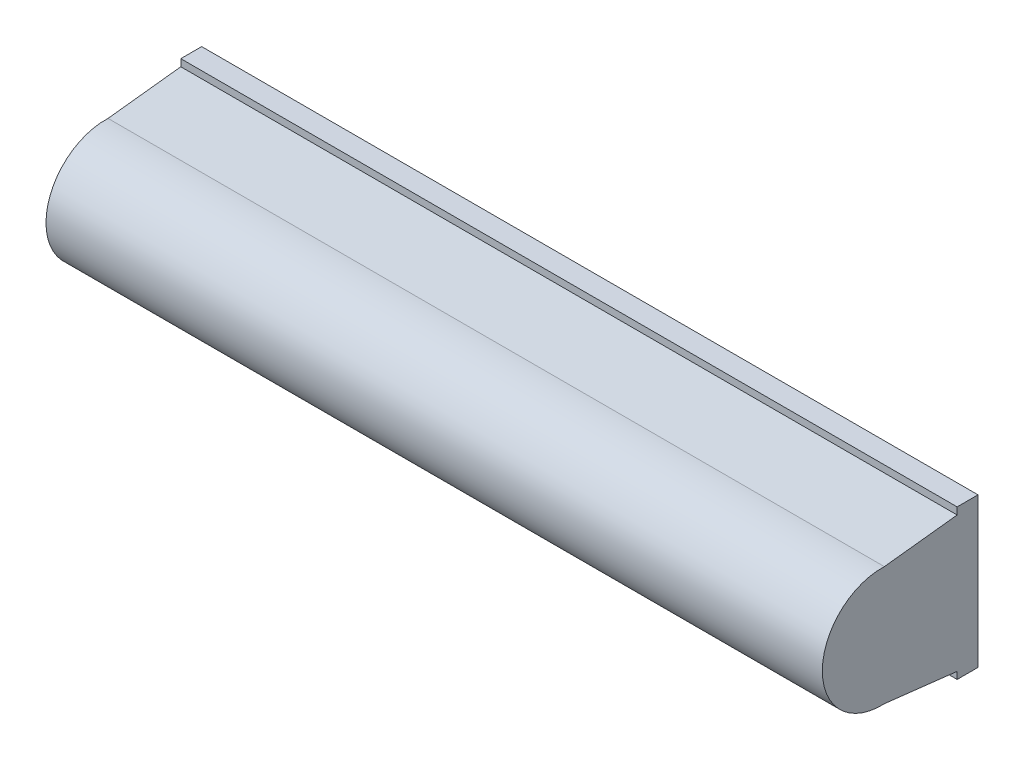
ISO-10303-21;
HEADER;
FILE_DESCRIPTION(('STEP AP214'),'2;1');
FILE_NAME('part.step','',(''),(''),'','','');
FILE_SCHEMA(('AUTOMOTIVE_DESIGN { 1 0 10303 214 1 1 1 1 }'));
ENDSEC;
DATA;
#1=APPLICATION_CONTEXT('core data for automotive mechanical design processes');
#2=APPLICATION_PROTOCOL_DEFINITION('international standard','automotive_design',2000,#1);
#3=PRODUCT_CONTEXT('',#1,'mechanical');
#4=PRODUCT('Part','Part','',(#3));
#5=PRODUCT_RELATED_PRODUCT_CATEGORY('part','',(#4));
#6=PRODUCT_DEFINITION_FORMATION('','',#4);
#7=PRODUCT_DEFINITION_CONTEXT('part definition',#1,'design');
#8=PRODUCT_DEFINITION('design','',#6,#7);
#9=PRODUCT_DEFINITION_SHAPE('','',#8);
#10=(LENGTH_UNIT() NAMED_UNIT(*) SI_UNIT(.MILLI.,.METRE.));
#11=(NAMED_UNIT(*) PLANE_ANGLE_UNIT() SI_UNIT($,.RADIAN.));
#12=(NAMED_UNIT(*) SI_UNIT($,.STERADIAN.) SOLID_ANGLE_UNIT());
#13=UNCERTAINTY_MEASURE_WITH_UNIT(LENGTH_MEASURE(1.E-05),#10,'distance_accuracy_value','');
#14=(GEOMETRIC_REPRESENTATION_CONTEXT(3) GLOBAL_UNCERTAINTY_ASSIGNED_CONTEXT((#13)) GLOBAL_UNIT_ASSIGNED_CONTEXT((#10,
#11,#12)) REPRESENTATION_CONTEXT('',''));
#15=CARTESIAN_POINT('',(0.,0.,0.));
#16=DIRECTION('',(0.,0.,1.));
#17=DIRECTION('',(1.,0.,0.));
#18=AXIS2_PLACEMENT_3D('',#15,#16,#17);
#19=CARTESIAN_POINT('',(80.,-15.405,4.3));
#20=DIRECTION('',(0.,1.,0.));
#21=DIRECTION('',(0.,0.,1.));
#22=AXIS2_PLACEMENT_3D('',#19,#20,#21);
#23=PLANE('',#22);
#24=DIRECTION('',(0.,0.,-1.));
#25=VECTOR('',#24,1.);
#26=CARTESIAN_POINT('',(-80.,-15.405,4.3));
#27=LINE('',#26,#25);
#28=CARTESIAN_POINT('',(-80.,-15.405,4.3));
#29=VERTEX_POINT('',#28);
#30=CARTESIAN_POINT('',(-80.,-15.405,0.));
#31=VERTEX_POINT('',#30);
#32=EDGE_CURVE('E129',#29,#31,#27,.T.);
#33=ORIENTED_EDGE('',*,*,#32,.T.);
#34=DIRECTION('',(-1.,0.,0.));
#35=VECTOR('',#34,1.);
#36=CARTESIAN_POINT('',(80.,-15.405,0.));
#37=LINE('',#36,#35);
#38=CARTESIAN_POINT('',(80.,-15.405,0.));
#39=VERTEX_POINT('',#38);
#40=EDGE_CURVE('E11',#39,#31,#37,.T.);
#41=ORIENTED_EDGE('',*,*,#40,.F.);
#42=DIRECTION('',(0.,0.,-1.));
#43=VECTOR('',#42,1.);
#44=CARTESIAN_POINT('',(80.,-15.405,4.3));
#45=LINE('',#44,#43);
#46=CARTESIAN_POINT('',(80.,-15.405,4.3));
#47=VERTEX_POINT('',#46);
#48=EDGE_CURVE('E143',#47,#39,#45,.T.);
#49=ORIENTED_EDGE('',*,*,#48,.F.);
#50=DIRECTION('',(-1.,0.,0.));
#51=VECTOR('',#50,1.);
#52=CARTESIAN_POINT('',(80.,-15.405,4.3));
#53=LINE('',#52,#51);
#54=EDGE_CURVE('E125',#47,#29,#53,.T.);
#55=ORIENTED_EDGE('',*,*,#54,.T.);
#56=EDGE_LOOP('',(#33,#41,#49,#55));
#57=FACE_BOUND('',#56,.T.);
#58=ADVANCED_FACE('F33',(#57),#23,.F.);
#59=CARTESIAN_POINT('',(80.,-15.405,0.));
#60=DIRECTION('',(0.,0.,1.));
#61=DIRECTION('',(1.,0.,0.));
#62=AXIS2_PLACEMENT_3D('',#59,#60,#61);
#63=PLANE('',#62);
#64=DIRECTION('',(0.,1.,0.));
#65=VECTOR('',#64,1.);
#66=CARTESIAN_POINT('',(-80.,-15.405,0.));
#67=LINE('',#66,#65);
#68=CARTESIAN_POINT('',(-80.,15.405,0.));
#69=VERTEX_POINT('',#68);
#70=EDGE_CURVE('E132',#31,#69,#67,.T.);
#71=ORIENTED_EDGE('',*,*,#70,.T.);
#72=DIRECTION('',(-1.,0.,0.));
#73=VECTOR('',#72,1.);
#74=CARTESIAN_POINT('',(80.,15.405,0.));
#75=LINE('',#74,#73);
#76=CARTESIAN_POINT('',(80.,15.405,0.));
#77=VERTEX_POINT('',#76);
#78=EDGE_CURVE('E41',#77,#69,#75,.T.);
#79=ORIENTED_EDGE('',*,*,#78,.F.);
#80=DIRECTION('',(0.,1.,0.));
#81=VECTOR('',#80,1.);
#82=CARTESIAN_POINT('',(80.,-15.405,0.));
#83=LINE('',#82,#81);
#84=EDGE_CURVE('E92',#39,#77,#83,.T.);
#85=ORIENTED_EDGE('',*,*,#84,.F.);
#86=ORIENTED_EDGE('',*,*,#40,.T.);
#87=EDGE_LOOP('',(#71,#79,#85,#86));
#88=FACE_BOUND('',#87,.T.);
#89=ADVANCED_FACE('F178',(#88),#63,.F.);
#90=CARTESIAN_POINT('',(80.,15.405,0.));
#91=DIRECTION('',(0.,-1.,0.));
#92=DIRECTION('',(0.,0.,-1.));
#93=AXIS2_PLACEMENT_3D('',#90,#91,#92);
#94=PLANE('',#93);
#95=DIRECTION('',(0.,0.,1.));
#96=VECTOR('',#95,1.);
#97=CARTESIAN_POINT('',(-80.,15.405,0.));
#98=LINE('',#97,#96);
#99=CARTESIAN_POINT('',(-80.,15.405,4.3));
#100=VERTEX_POINT('',#99);
#101=EDGE_CURVE('E134',#69,#100,#98,.T.);
#102=ORIENTED_EDGE('',*,*,#101,.T.);
#103=DIRECTION('',(-1.,0.,0.));
#104=VECTOR('',#103,1.);
#105=CARTESIAN_POINT('',(80.,15.405,4.3));
#106=LINE('',#105,#104);
#107=CARTESIAN_POINT('',(80.,15.405,4.3));
#108=VERTEX_POINT('',#107);
#109=EDGE_CURVE('E150',#108,#100,#106,.T.);
#110=ORIENTED_EDGE('',*,*,#109,.F.);
#111=DIRECTION('',(0.,0.,1.));
#112=VECTOR('',#111,1.);
#113=CARTESIAN_POINT('',(80.,15.405,0.));
#114=LINE('',#113,#112);
#115=EDGE_CURVE('E158',#77,#108,#114,.T.);
#116=ORIENTED_EDGE('',*,*,#115,.F.);
#117=ORIENTED_EDGE('',*,*,#78,.T.);
#118=EDGE_LOOP('',(#102,#110,#116,#117));
#119=FACE_BOUND('',#118,.T.);
#120=ADVANCED_FACE('F156',(#119),#94,.F.);
#121=CARTESIAN_POINT('',(80.,15.405,4.3));
#122=DIRECTION('',(0.,0.,-1.));
#123=DIRECTION('',(-1.,0.,0.));
#124=AXIS2_PLACEMENT_3D('',#121,#122,#123);
#125=PLANE('',#124);
#126=DIRECTION('',(0.,-1.,0.));
#127=VECTOR('',#126,1.);
#128=CARTESIAN_POINT('',(-80.,15.405,4.3));
#129=LINE('',#128,#127);
#130=CARTESIAN_POINT('',(-80.,13.955,4.3));
#131=VERTEX_POINT('',#130);
#132=EDGE_CURVE('E136',#100,#131,#129,.T.);
#133=ORIENTED_EDGE('',*,*,#132,.T.);
#134=DIRECTION('',(-1.,0.,0.));
#135=VECTOR('',#134,1.);
#136=CARTESIAN_POINT('',(80.,13.955,4.3));
#137=LINE('',#136,#135);
#138=CARTESIAN_POINT('',(80.,13.955,4.3));
#139=VERTEX_POINT('',#138);
#140=EDGE_CURVE('E147',#139,#131,#137,.T.);
#141=ORIENTED_EDGE('',*,*,#140,.F.);
#142=DIRECTION('',(0.,-1.,0.));
#143=VECTOR('',#142,1.);
#144=CARTESIAN_POINT('',(80.,15.405,4.3));
#145=LINE('',#144,#143);
#146=EDGE_CURVE('E170',#108,#139,#145,.T.);
#147=ORIENTED_EDGE('',*,*,#146,.F.);
#148=ORIENTED_EDGE('',*,*,#109,.T.);
#149=EDGE_LOOP('',(#133,#141,#147,#148));
#150=FACE_BOUND('',#149,.T.);
#151=ADVANCED_FACE('F166',(#150),#125,.F.);
#152=CARTESIAN_POINT('',(80.,13.955,4.3));
#153=DIRECTION('',(0.,-0.993511209391801,-0.113734237645665));
#154=DIRECTION('',(0.,0.113734237645665,-0.993511209391801));
#155=AXIS2_PLACEMENT_3D('',#152,#153,#154);
#156=PLANE('',#155);
#157=DIRECTION('',(0.,-0.113734237645665,0.993511209391801));
#158=VECTOR('',#157,1.);
#159=CARTESIAN_POINT('',(-80.,13.955,4.3));
#160=LINE('',#159,#158);
#161=CARTESIAN_POINT('',(-80.,12.2383407143778,19.2956625047746));
#162=VERTEX_POINT('',#161);
#163=EDGE_CURVE('E138',#131,#162,#160,.T.);
#164=ORIENTED_EDGE('',*,*,#163,.T.);
#165=DIRECTION('',(-1.,0.,0.));
#166=VECTOR('',#165,1.);
#167=CARTESIAN_POINT('',(80.,12.2383407143778,19.2956625047746));
#168=LINE('',#167,#166);
#169=CARTESIAN_POINT('',(80.,12.2383407143778,19.2956625047746));
#170=VERTEX_POINT('',#169);
#171=EDGE_CURVE('E120',#170,#162,#168,.T.);
#172=ORIENTED_EDGE('',*,*,#171,.F.);
#173=DIRECTION('',(0.,-0.113734237645665,0.993511209391801));
#174=VECTOR('',#173,1.);
#175=CARTESIAN_POINT('',(80.,13.955,4.3));
#176=LINE('',#175,#174);
#177=EDGE_CURVE('E111',#139,#170,#176,.T.);
#178=ORIENTED_EDGE('',*,*,#177,.F.);
#179=ORIENTED_EDGE('',*,*,#140,.T.);
#180=EDGE_LOOP('',(#164,#172,#178,#179));
#181=FACE_BOUND('',#180,.T.);
#182=ADVANCED_FACE('F169',(#181),#156,.F.);
#183=CARTESIAN_POINT('',(80.,0.,19.83));
#184=DIRECTION('',(-1.,0.,0.));
#185=DIRECTION('',(0.,0.,1.));
#186=AXIS2_PLACEMENT_3D('',#183,#184,#185);
#187=CYLINDRICAL_SURFACE('',#186,12.25);
#188=CARTESIAN_POINT('',(-80.,0.,19.83));
#189=DIRECTION('',(1.,0.,0.));
#190=DIRECTION('',(0.,0.,-1.));
#191=AXIS2_PLACEMENT_3D('',#188,#189,#190);
#192=CIRCLE('',#191,12.25);
#193=CARTESIAN_POINT('',(-80.,-12.2383407143778,19.2956625047746));
#194=VERTEX_POINT('',#193);
#195=EDGE_CURVE('E119',#162,#194,#192,.T.);
#196=ORIENTED_EDGE('',*,*,#195,.T.);
#197=DIRECTION('',(-1.,0.,0.));
#198=VECTOR('',#197,1.);
#199=CARTESIAN_POINT('',(80.,-12.2383407143778,19.2956625047746));
#200=LINE('',#199,#198);
#201=CARTESIAN_POINT('',(80.,-12.2383407143778,19.2956625047746));
#202=VERTEX_POINT('',#201);
#203=EDGE_CURVE('E116',#202,#194,#200,.T.);
#204=ORIENTED_EDGE('',*,*,#203,.F.);
#205=CARTESIAN_POINT('',(80.,0.,19.83));
#206=DIRECTION('',(1.,0.,0.));
#207=DIRECTION('',(0.,0.,-1.));
#208=AXIS2_PLACEMENT_3D('',#205,#206,#207);
#209=CIRCLE('',#208,12.25);
#210=EDGE_CURVE('E105',#170,#202,#209,.T.);
#211=ORIENTED_EDGE('',*,*,#210,.F.);
#212=ORIENTED_EDGE('',*,*,#171,.T.);
#213=EDGE_LOOP('',(#196,#204,#211,#212));
#214=FACE_BOUND('',#213,.T.);
#215=ADVANCED_FACE('F117',(#214),#187,.T.);
#216=CARTESIAN_POINT('',(80.,-12.2383407143778,19.2956625047746));
#217=DIRECTION('',(0.,0.993511209391801,-0.113734237645665));
#218=DIRECTION('',(0.,0.113734237645665,0.993511209391801));
#219=AXIS2_PLACEMENT_3D('',#216,#217,#218);
#220=PLANE('',#219);
#221=DIRECTION('',(0.,-0.113734237645665,-0.993511209391801));
#222=VECTOR('',#221,1.);
#223=CARTESIAN_POINT('',(-80.,-12.2383407143778,19.2956625047746));
#224=LINE('',#223,#222);
#225=CARTESIAN_POINT('',(-80.,-13.955,4.3));
#226=VERTEX_POINT('',#225);
#227=EDGE_CURVE('E78',#194,#226,#224,.T.);
#228=ORIENTED_EDGE('',*,*,#227,.T.);
#229=DIRECTION('',(-1.,0.,0.));
#230=VECTOR('',#229,1.);
#231=CARTESIAN_POINT('',(80.,-13.955,4.3));
#232=LINE('',#231,#230);
#233=CARTESIAN_POINT('',(80.,-13.955,4.3));
#234=VERTEX_POINT('',#233);
#235=EDGE_CURVE('E121',#234,#226,#232,.T.);
#236=ORIENTED_EDGE('',*,*,#235,.F.);
#237=DIRECTION('',(0.,-0.113734237645665,-0.993511209391801));
#238=VECTOR('',#237,1.);
#239=CARTESIAN_POINT('',(80.,-12.2383407143778,19.2956625047746));
#240=LINE('',#239,#238);
#241=EDGE_CURVE('E109',#202,#234,#240,.T.);
#242=ORIENTED_EDGE('',*,*,#241,.F.);
#243=ORIENTED_EDGE('',*,*,#203,.T.);
#244=EDGE_LOOP('',(#228,#236,#242,#243));
#245=FACE_BOUND('',#244,.T.);
#246=ADVANCED_FACE('F123',(#245),#220,.F.);
#247=CARTESIAN_POINT('',(80.,-13.955,4.3));
#248=DIRECTION('',(0.,0.,-1.));
#249=DIRECTION('',(-1.,0.,0.));
#250=AXIS2_PLACEMENT_3D('',#247,#248,#249);
#251=PLANE('',#250);
#252=DIRECTION('',(0.,-1.,0.));
#253=VECTOR('',#252,1.);
#254=CARTESIAN_POINT('',(-80.,-13.955,4.3));
#255=LINE('',#254,#253);
#256=EDGE_CURVE('E84',#226,#29,#255,.T.);
#257=ORIENTED_EDGE('',*,*,#256,.T.);
#258=ORIENTED_EDGE('',*,*,#54,.F.);
#259=DIRECTION('',(0.,-1.,0.));
#260=VECTOR('',#259,1.);
#261=CARTESIAN_POINT('',(80.,-13.955,4.3));
#262=LINE('',#261,#260);
#263=EDGE_CURVE('E49',#234,#47,#262,.T.);
#264=ORIENTED_EDGE('',*,*,#263,.F.);
#265=ORIENTED_EDGE('',*,*,#235,.T.);
#266=EDGE_LOOP('',(#257,#258,#264,#265));
#267=FACE_BOUND('',#266,.T.);
#268=ADVANCED_FACE('F194',(#267),#251,.F.);
#269=CARTESIAN_POINT('',(80.,0.,19.83));
#270=DIRECTION('',(1.,0.,0.));
#271=DIRECTION('',(0.,0.,-1.));
#272=AXIS2_PLACEMENT_3D('',#269,#270,#271);
#273=PLANE('',#272);
#274=ORIENTED_EDGE('',*,*,#48,.T.);
#275=ORIENTED_EDGE('',*,*,#84,.T.);
#276=ORIENTED_EDGE('',*,*,#115,.T.);
#277=ORIENTED_EDGE('',*,*,#146,.T.);
#278=ORIENTED_EDGE('',*,*,#177,.T.);
#279=ORIENTED_EDGE('',*,*,#210,.T.);
#280=ORIENTED_EDGE('',*,*,#241,.T.);
#281=ORIENTED_EDGE('',*,*,#263,.T.);
#282=EDGE_LOOP('',(#274,#275,#276,#277,#278,#279,#280,#281));
#283=FACE_BOUND('',#282,.T.);
#284=ADVANCED_FACE('F107',(#283),#273,.T.);
#285=CARTESIAN_POINT('',(-80.,0.,19.83));
#286=DIRECTION('',(1.,0.,0.));
#287=DIRECTION('',(0.,0.,-1.));
#288=AXIS2_PLACEMENT_3D('',#285,#286,#287);
#289=PLANE('',#288);
#290=ORIENTED_EDGE('',*,*,#32,.F.);
#291=ORIENTED_EDGE('',*,*,#256,.F.);
#292=ORIENTED_EDGE('',*,*,#227,.F.);
#293=ORIENTED_EDGE('',*,*,#195,.F.);
#294=ORIENTED_EDGE('',*,*,#163,.F.);
#295=ORIENTED_EDGE('',*,*,#132,.F.);
#296=ORIENTED_EDGE('',*,*,#101,.F.);
#297=ORIENTED_EDGE('',*,*,#70,.F.);
#298=EDGE_LOOP('',(#290,#291,#292,#293,#294,#295,#296,#297));
#299=FACE_BOUND('',#298,.T.);
#300=ADVANCED_FACE('F162',(#299),#289,.F.);
#301=CLOSED_SHELL('',(#58,#89,#120,#151,#182,#215,#246,#268,#284,#300));
#302=MANIFOLD_SOLID_BREP('B2',#301);
#303=ADVANCED_BREP_SHAPE_REPRESENTATION('',(#18,#302),#14);
#304=SHAPE_DEFINITION_REPRESENTATION(#9,#303);
ENDSEC;
END-ISO-10303-21;
